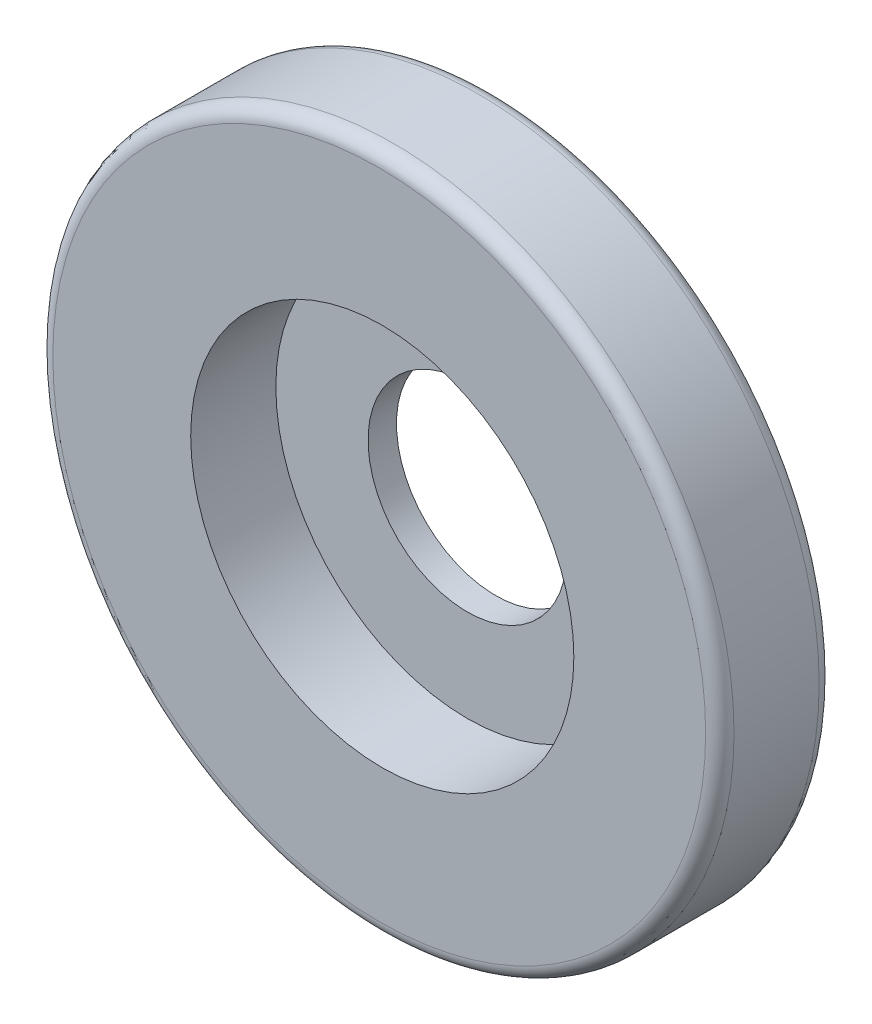
ISO-10303-21;
HEADER;
FILE_DESCRIPTION(('STEP AP214'),'2;1');
FILE_NAME('part.step','',(''),(''),'','','');
FILE_SCHEMA(('AUTOMOTIVE_DESIGN { 1 0 10303 214 1 1 1 1 }'));
ENDSEC;
DATA;
#1=APPLICATION_CONTEXT('core data for automotive mechanical design processes');
#2=APPLICATION_PROTOCOL_DEFINITION('international standard','automotive_design',2000,#1);
#3=PRODUCT_CONTEXT('',#1,'mechanical');
#4=PRODUCT('Part','Part','',(#3));
#5=PRODUCT_RELATED_PRODUCT_CATEGORY('part','',(#4));
#6=PRODUCT_DEFINITION_FORMATION('','',#4);
#7=PRODUCT_DEFINITION_CONTEXT('part definition',#1,'design');
#8=PRODUCT_DEFINITION('design','',#6,#7);
#9=PRODUCT_DEFINITION_SHAPE('','',#8);
#10=(LENGTH_UNIT() NAMED_UNIT(*) SI_UNIT(.MILLI.,.METRE.));
#11=(NAMED_UNIT(*) PLANE_ANGLE_UNIT() SI_UNIT($,.RADIAN.));
#12=(NAMED_UNIT(*) SI_UNIT($,.STERADIAN.) SOLID_ANGLE_UNIT());
#13=UNCERTAINTY_MEASURE_WITH_UNIT(LENGTH_MEASURE(1.E-05),#10,'distance_accuracy_value','');
#14=(GEOMETRIC_REPRESENTATION_CONTEXT(3) GLOBAL_UNCERTAINTY_ASSIGNED_CONTEXT((#13)) GLOBAL_UNIT_ASSIGNED_CONTEXT((#10,
#11,#12)) REPRESENTATION_CONTEXT('',''));
#15=CARTESIAN_POINT('',(0.,0.,0.));
#16=DIRECTION('',(0.,0.,1.));
#17=DIRECTION('',(1.,0.,0.));
#18=AXIS2_PLACEMENT_3D('',#15,#16,#17);
#19=CARTESIAN_POINT('',(-0.0535240781430793,0.,0.5));
#20=DIRECTION('',(0.,0.,1.));
#21=DIRECTION('',(1.,0.,0.));
#22=AXIS2_PLACEMENT_3D('',#19,#20,#21);
#23=PLANE('',#22);
#24=CARTESIAN_POINT('',(0.,0.,0.5));
#25=DIRECTION('',(0.,0.,1.));
#26=DIRECTION('',(1.,0.,0.));
#27=AXIS2_PLACEMENT_3D('',#24,#25,#26);
#28=CIRCLE('',#27,1.75);
#29=CARTESIAN_POINT('',(1.75,0.,0.5));
#30=VERTEX_POINT('',#29);
#31=EDGE_CURVE('E61',#30,#30,#28,.T.);
#32=ORIENTED_EDGE('',*,*,#31,.F.);
#33=EDGE_LOOP('',(#32));
#34=FACE_BOUND('',#33,.T.);
#35=CARTESIAN_POINT('',(0.,0.,0.5));
#36=DIRECTION('',(0.,0.,1.));
#37=DIRECTION('',(1.,0.,0.));
#38=AXIS2_PLACEMENT_3D('',#35,#36,#37);
#39=CIRCLE('',#38,3.375);
#40=CARTESIAN_POINT('',(3.375,0.,0.5));
#41=VERTEX_POINT('',#40);
#42=EDGE_CURVE('E70',#41,#41,#39,.T.);
#43=ORIENTED_EDGE('',*,*,#42,.T.);
#44=EDGE_LOOP('',(#43));
#45=FACE_BOUND('',#44,.T.);
#46=ADVANCED_FACE('F37',(#34,#45),#23,.T.);
#47=CARTESIAN_POINT('',(-0.0535240781430793,0.,0.));
#48=DIRECTION('',(0.,0.,1.));
#49=DIRECTION('',(1.,0.,0.));
#50=AXIS2_PLACEMENT_3D('',#47,#48,#49);
#51=PLANE('',#50);
#52=CARTESIAN_POINT('',(-0.0535240781430793,0.,0.));
#53=DIRECTION('',(0.,0.,1.));
#54=DIRECTION('',(1.,0.,0.));
#55=AXIS2_PLACEMENT_3D('',#52,#53,#54);
#56=CIRCLE('',#55,5.75);
#57=CARTESIAN_POINT('',(5.69647592185692,0.,0.));
#58=VERTEX_POINT('',#57);
#59=EDGE_CURVE('E10',#58,#58,#56,.F.);
#60=ORIENTED_EDGE('',*,*,#59,.T.);
#61=EDGE_LOOP('',(#60));
#62=FACE_BOUND('',#61,.T.);
#63=CARTESIAN_POINT('',(0.,0.,0.));
#64=DIRECTION('',(0.,0.,1.));
#65=DIRECTION('',(1.,0.,0.));
#66=AXIS2_PLACEMENT_3D('',#63,#64,#65);
#67=CIRCLE('',#66,1.75);
#68=CARTESIAN_POINT('',(1.75,0.,0.));
#69=VERTEX_POINT('',#68);
#70=EDGE_CURVE('E62',#69,#69,#67,.T.);
#71=ORIENTED_EDGE('',*,*,#70,.T.);
#72=EDGE_LOOP('',(#71));
#73=FACE_BOUND('',#72,.T.);
#74=ADVANCED_FACE('F96',(#62,#73),#51,.F.);
#75=CARTESIAN_POINT('',(-0.0535240781430793,0.,0.5));
#76=DIRECTION('',(0.,0.,-1.));
#77=DIRECTION('',(-1.,0.,0.));
#78=AXIS2_PLACEMENT_3D('',#75,#76,#77);
#79=CYLINDRICAL_SURFACE('',#78,6.);
#80=CARTESIAN_POINT('',(-0.0535240781430793,0.,1.75));
#81=DIRECTION('',(0.,0.,1.));
#82=DIRECTION('',(1.,0.,0.));
#83=AXIS2_PLACEMENT_3D('',#80,#81,#82);
#84=CIRCLE('',#83,6.);
#85=CARTESIAN_POINT('',(5.94647592185692,0.,1.75));
#86=VERTEX_POINT('',#85);
#87=EDGE_CURVE('E45',#86,#86,#84,.F.);
#88=ORIENTED_EDGE('',*,*,#87,.T.);
#89=EDGE_LOOP('',(#88));
#90=FACE_BOUND('',#89,.T.);
#91=CARTESIAN_POINT('',(-0.0535240781430793,0.,0.25));
#92=DIRECTION('',(0.,0.,1.));
#93=DIRECTION('',(1.,0.,0.));
#94=AXIS2_PLACEMENT_3D('',#91,#92,#93);
#95=CIRCLE('',#94,6.);
#96=CARTESIAN_POINT('',(5.94647592185692,0.,0.25));
#97=VERTEX_POINT('',#96);
#98=EDGE_CURVE('E50',#97,#97,#95,.T.);
#99=ORIENTED_EDGE('',*,*,#98,.T.);
#100=EDGE_LOOP('',(#99));
#101=FACE_BOUND('',#100,.T.);
#102=ADVANCED_FACE('F92',(#90,#101),#79,.T.);
#103=CARTESIAN_POINT('',(0.,0.,0.5));
#104=DIRECTION('',(0.,0.,-1.));
#105=DIRECTION('',(-1.,0.,0.));
#106=AXIS2_PLACEMENT_3D('',#103,#104,#105);
#107=CYLINDRICAL_SURFACE('',#106,1.75);
#108=ORIENTED_EDGE('',*,*,#31,.T.);
#109=EDGE_LOOP('',(#108));
#110=FACE_BOUND('',#109,.T.);
#111=ORIENTED_EDGE('',*,*,#70,.F.);
#112=EDGE_LOOP('',(#111));
#113=FACE_BOUND('',#112,.T.);
#114=ADVANCED_FACE('F83',(#110,#113),#107,.F.);
#115=CARTESIAN_POINT('',(-0.0535240781430793,0.,2.));
#116=DIRECTION('',(0.,0.,1.));
#117=DIRECTION('',(1.,0.,0.));
#118=AXIS2_PLACEMENT_3D('',#115,#116,#117);
#119=PLANE('',#118);
#120=CARTESIAN_POINT('',(-0.0535240781430793,0.,2.));
#121=DIRECTION('',(0.,0.,1.));
#122=DIRECTION('',(1.,0.,0.));
#123=AXIS2_PLACEMENT_3D('',#120,#121,#122);
#124=CIRCLE('',#123,5.75);
#125=CARTESIAN_POINT('',(5.69647592185692,0.,2.));
#126=VERTEX_POINT('',#125);
#127=EDGE_CURVE('E55',#126,#126,#124,.T.);
#128=ORIENTED_EDGE('',*,*,#127,.T.);
#129=EDGE_LOOP('',(#128));
#130=FACE_BOUND('',#129,.T.);
#131=CARTESIAN_POINT('',(0.,0.,2.));
#132=DIRECTION('',(0.,0.,1.));
#133=DIRECTION('',(1.,0.,0.));
#134=AXIS2_PLACEMENT_3D('',#131,#132,#133);
#135=CIRCLE('',#134,3.375);
#136=CARTESIAN_POINT('',(3.375,0.,2.));
#137=VERTEX_POINT('',#136);
#138=EDGE_CURVE('E66',#137,#137,#135,.T.);
#139=ORIENTED_EDGE('',*,*,#138,.F.);
#140=EDGE_LOOP('',(#139));
#141=FACE_BOUND('',#140,.T.);
#142=ADVANCED_FACE('F81',(#130,#141),#119,.T.);
#143=CARTESIAN_POINT('',(0.,0.,2.));
#144=DIRECTION('',(0.,0.,-1.));
#145=DIRECTION('',(-1.,0.,0.));
#146=AXIS2_PLACEMENT_3D('',#143,#144,#145);
#147=CYLINDRICAL_SURFACE('',#146,3.375);
#148=ORIENTED_EDGE('',*,*,#138,.T.);
#149=EDGE_LOOP('',(#148));
#150=FACE_BOUND('',#149,.T.);
#151=ORIENTED_EDGE('',*,*,#42,.F.);
#152=EDGE_LOOP('',(#151));
#153=FACE_BOUND('',#152,.T.);
#154=ADVANCED_FACE('F78',(#150,#153),#147,.F.);
#155=CARTESIAN_POINT('',(-0.0535240781430793,0.,1.75));
#156=DIRECTION('',(0.,0.,1.));
#157=DIRECTION('',(1.,0.,0.));
#158=AXIS2_PLACEMENT_3D('',#155,#156,#157);
#159=TOROIDAL_SURFACE('',#158,5.75,0.25);
#160=ORIENTED_EDGE('',*,*,#87,.F.);
#161=EDGE_LOOP('',(#160));
#162=FACE_BOUND('',#161,.T.);
#163=ORIENTED_EDGE('',*,*,#127,.F.);
#164=EDGE_LOOP('',(#163));
#165=FACE_BOUND('',#164,.T.);
#166=ADVANCED_FACE('F90',(#162,#165),#159,.T.);
#167=CARTESIAN_POINT('',(-0.0535240781430793,0.,0.25));
#168=DIRECTION('',(0.,0.,1.));
#169=DIRECTION('',(1.,0.,0.));
#170=AXIS2_PLACEMENT_3D('',#167,#168,#169);
#171=TOROIDAL_SURFACE('',#170,5.75,0.25);
#172=ORIENTED_EDGE('',*,*,#59,.F.);
#173=EDGE_LOOP('',(#172));
#174=FACE_BOUND('',#173,.T.);
#175=ORIENTED_EDGE('',*,*,#98,.F.);
#176=EDGE_LOOP('',(#175));
#177=FACE_BOUND('',#176,.T.);
#178=ADVANCED_FACE('F39',(#174,#177),#171,.T.);
#179=CLOSED_SHELL('',(#46,#74,#102,#114,#142,#154,#166,#178));
#180=MANIFOLD_SOLID_BREP('B2',#179);
#181=ADVANCED_BREP_SHAPE_REPRESENTATION('',(#18,#180),#14);
#182=SHAPE_DEFINITION_REPRESENTATION(#9,#181);
ENDSEC;
END-ISO-10303-21;
